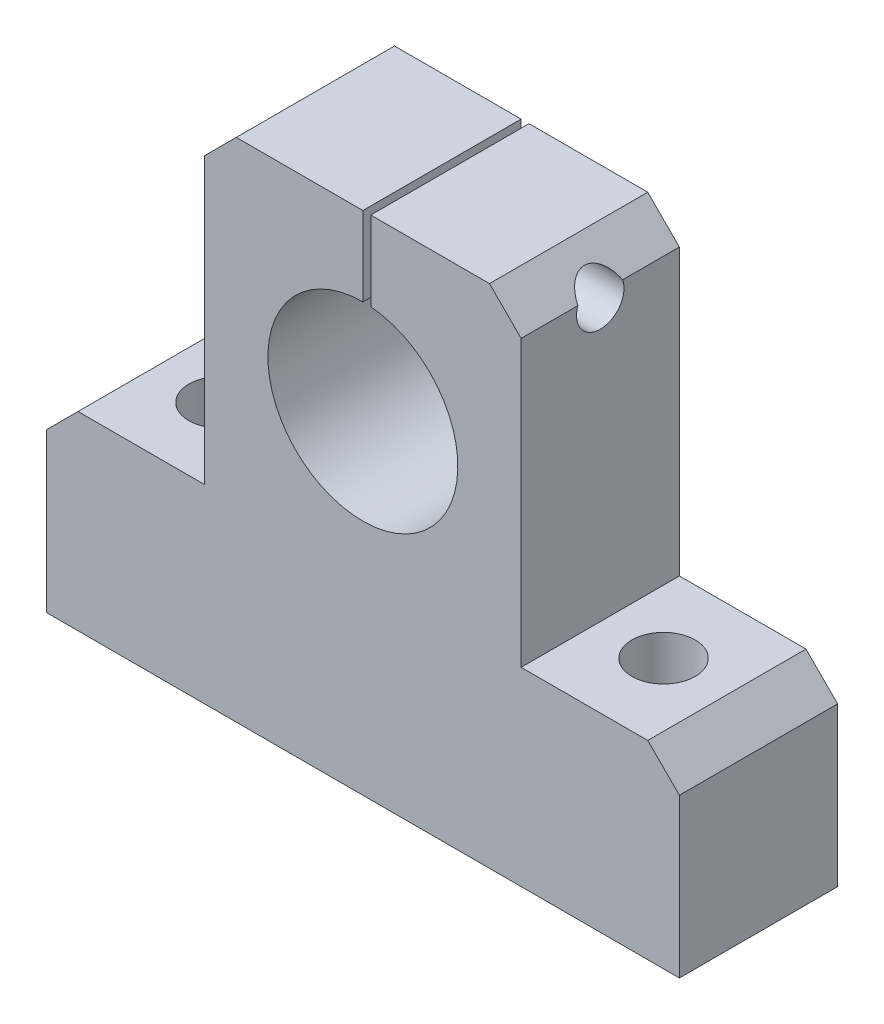
ISO-10303-21;
HEADER;
FILE_DESCRIPTION(('STEP AP214'),'2;1');
FILE_NAME('part.step','',(''),(''),'','','');
FILE_SCHEMA(('AUTOMOTIVE_DESIGN { 1 0 10303 214 1 1 1 1 }'));
ENDSEC;
DATA;
#1=APPLICATION_CONTEXT('core data for automotive mechanical design processes');
#2=APPLICATION_PROTOCOL_DEFINITION('international standard','automotive_design',2000,#1);
#3=PRODUCT_CONTEXT('',#1,'mechanical');
#4=PRODUCT('Part','Part','',(#3));
#5=PRODUCT_RELATED_PRODUCT_CATEGORY('part','',(#4));
#6=PRODUCT_DEFINITION_FORMATION('','',#4);
#7=PRODUCT_DEFINITION_CONTEXT('part definition',#1,'design');
#8=PRODUCT_DEFINITION('design','',#6,#7);
#9=PRODUCT_DEFINITION_SHAPE('','',#8);
#10=(LENGTH_UNIT() NAMED_UNIT(*) SI_UNIT(.MILLI.,.METRE.));
#11=(NAMED_UNIT(*) PLANE_ANGLE_UNIT() SI_UNIT($,.RADIAN.));
#12=(NAMED_UNIT(*) SI_UNIT($,.STERADIAN.) SOLID_ANGLE_UNIT());
#13=UNCERTAINTY_MEASURE_WITH_UNIT(LENGTH_MEASURE(1.E-05),#10,'distance_accuracy_value','');
#14=(GEOMETRIC_REPRESENTATION_CONTEXT(3) GLOBAL_UNCERTAINTY_ASSIGNED_CONTEXT((#13)) GLOBAL_UNIT_ASSIGNED_CONTEXT((#10,
#11,#12)) REPRESENTATION_CONTEXT('',''));
#15=CARTESIAN_POINT('',(0.,0.,0.));
#16=DIRECTION('',(0.,0.,1.));
#17=DIRECTION('',(1.,0.,0.));
#18=AXIS2_PLACEMENT_3D('',#15,#16,#17);
#19=CARTESIAN_POINT('',(-20.,0.,10.));
#20=DIRECTION('',(1.,0.,0.));
#21=DIRECTION('',(0.,0.,-1.));
#22=AXIS2_PLACEMENT_3D('',#19,#20,#21);
#23=PLANE('',#22);
#24=DIRECTION('',(0.,-1.,0.));
#25=VECTOR('',#24,1.);
#26=CARTESIAN_POINT('',(-20.,0.,0.));
#27=LINE('',#26,#25);
#28=CARTESIAN_POINT('',(-20.,10.,0.));
#29=VERTEX_POINT('',#28);
#30=CARTESIAN_POINT('',(-20.,0.,0.));
#31=VERTEX_POINT('',#30);
#32=EDGE_CURVE('E238',#29,#31,#27,.T.);
#33=ORIENTED_EDGE('',*,*,#32,.T.);
#34=DIRECTION('',(0.,0.,-1.));
#35=VECTOR('',#34,1.);
#36=CARTESIAN_POINT('',(-20.,0.,10.));
#37=LINE('',#36,#35);
#38=CARTESIAN_POINT('',(-20.,0.,10.));
#39=VERTEX_POINT('',#38);
#40=EDGE_CURVE('E44',#39,#31,#37,.T.);
#41=ORIENTED_EDGE('',*,*,#40,.F.);
#42=DIRECTION('',(0.,-1.,0.));
#43=VECTOR('',#42,1.);
#44=CARTESIAN_POINT('',(-20.,0.,10.));
#45=LINE('',#44,#43);
#46=CARTESIAN_POINT('',(-20.,10.,10.));
#47=VERTEX_POINT('',#46);
#48=EDGE_CURVE('E239',#47,#39,#45,.T.);
#49=ORIENTED_EDGE('',*,*,#48,.F.);
#50=DIRECTION('',(0.,0.,-1.));
#51=VECTOR('',#50,1.);
#52=CARTESIAN_POINT('',(-20.,10.,10.));
#53=LINE('',#52,#51);
#54=EDGE_CURVE('E272',#47,#29,#53,.T.);
#55=ORIENTED_EDGE('',*,*,#54,.T.);
#56=EDGE_LOOP('',(#33,#41,#49,#55));
#57=FACE_BOUND('',#56,.T.);
#58=ADVANCED_FACE('F36',(#57),#23,.F.);
#59=CARTESIAN_POINT('',(20.,0.,10.));
#60=DIRECTION('',(0.,1.,0.));
#61=DIRECTION('',(-1.,0.,0.));
#62=AXIS2_PLACEMENT_3D('',#59,#60,#61);
#63=PLANE('',#62);
#64=CARTESIAN_POINT('',(14.,0.,5.));
#65=DIRECTION('',(0.,1.,0.));
#66=DIRECTION('',(-1.,0.,0.));
#67=AXIS2_PLACEMENT_3D('',#64,#65,#66);
#68=CIRCLE('',#67,2.);
#69=CARTESIAN_POINT('',(12.,0.,5.));
#70=VERTEX_POINT('',#69);
#71=EDGE_CURVE('E218',#70,#70,#68,.F.);
#72=ORIENTED_EDGE('',*,*,#71,.F.);
#73=EDGE_LOOP('',(#72));
#74=FACE_BOUND('',#73,.T.);
#75=CARTESIAN_POINT('',(-14.,0.,5.));
#76=DIRECTION('',(0.,1.,0.));
#77=DIRECTION('',(-1.,0.,0.));
#78=AXIS2_PLACEMENT_3D('',#75,#76,#77);
#79=CIRCLE('',#78,2.);
#80=CARTESIAN_POINT('',(-16.,0.,5.));
#81=VERTEX_POINT('',#80);
#82=EDGE_CURVE('E223',#81,#81,#79,.F.);
#83=ORIENTED_EDGE('',*,*,#82,.F.);
#84=EDGE_LOOP('',(#83));
#85=FACE_BOUND('',#84,.T.);
#86=DIRECTION('',(1.,0.,0.));
#87=VECTOR('',#86,1.);
#88=CARTESIAN_POINT('',(20.,0.,0.));
#89=LINE('',#88,#87);
#90=CARTESIAN_POINT('',(20.,0.,0.));
#91=VERTEX_POINT('',#90);
#92=EDGE_CURVE('E275',#31,#91,#89,.T.);
#93=ORIENTED_EDGE('',*,*,#92,.T.);
#94=DIRECTION('',(0.,0.,-1.));
#95=VECTOR('',#94,1.);
#96=CARTESIAN_POINT('',(20.,0.,10.));
#97=LINE('',#96,#95);
#98=CARTESIAN_POINT('',(20.,0.,10.));
#99=VERTEX_POINT('',#98);
#100=EDGE_CURVE('E212',#99,#91,#97,.T.);
#101=ORIENTED_EDGE('',*,*,#100,.F.);
#102=DIRECTION('',(1.,0.,0.));
#103=VECTOR('',#102,1.);
#104=CARTESIAN_POINT('',(20.,0.,10.));
#105=LINE('',#104,#103);
#106=EDGE_CURVE('E242',#39,#99,#105,.T.);
#107=ORIENTED_EDGE('',*,*,#106,.F.);
#108=ORIENTED_EDGE('',*,*,#40,.T.);
#109=EDGE_LOOP('',(#93,#101,#107,#108));
#110=FACE_BOUND('',#109,.T.);
#111=ADVANCED_FACE('F382',(#74,#85,#110),#63,.F.);
#112=CARTESIAN_POINT('',(20.,0.,10.));
#113=DIRECTION('',(-1.,0.,0.));
#114=DIRECTION('',(0.,-1.,0.));
#115=AXIS2_PLACEMENT_3D('',#112,#113,#114);
#116=PLANE('',#115);
#117=DIRECTION('',(0.,1.,0.));
#118=VECTOR('',#117,1.);
#119=CARTESIAN_POINT('',(20.,0.,0.));
#120=LINE('',#119,#118);
#121=CARTESIAN_POINT('',(20.,10.,0.));
#122=VERTEX_POINT('',#121);
#123=EDGE_CURVE('E277',#91,#122,#120,.T.);
#124=ORIENTED_EDGE('',*,*,#123,.T.);
#125=DIRECTION('',(0.,0.,-1.));
#126=VECTOR('',#125,1.);
#127=CARTESIAN_POINT('',(20.,10.,10.));
#128=LINE('',#127,#126);
#129=CARTESIAN_POINT('',(20.,10.,10.));
#130=VERTEX_POINT('',#129);
#131=EDGE_CURVE('E209',#130,#122,#128,.T.);
#132=ORIENTED_EDGE('',*,*,#131,.F.);
#133=DIRECTION('',(0.,1.,0.));
#134=VECTOR('',#133,1.);
#135=CARTESIAN_POINT('',(20.,0.,10.));
#136=LINE('',#135,#134);
#137=EDGE_CURVE('E245',#99,#130,#136,.T.);
#138=ORIENTED_EDGE('',*,*,#137,.F.);
#139=ORIENTED_EDGE('',*,*,#100,.T.);
#140=EDGE_LOOP('',(#124,#132,#138,#139));
#141=FACE_BOUND('',#140,.T.);
#142=ADVANCED_FACE('F379',(#141),#116,.F.);
#143=CARTESIAN_POINT('',(20.,10.,10.));
#144=DIRECTION('',(-0.707106781186547,-0.707106781186548,0.));
#145=DIRECTION('',(0.707106781186548,-0.707106781186547,0.));
#146=AXIS2_PLACEMENT_3D('',#143,#144,#145);
#147=PLANE('',#146);
#148=DIRECTION('',(-0.707106781186548,0.707106781186547,0.));
#149=VECTOR('',#148,1.);
#150=CARTESIAN_POINT('',(20.,10.,0.));
#151=LINE('',#150,#149);
#152=CARTESIAN_POINT('',(18.,12.,0.));
#153=VERTEX_POINT('',#152);
#154=EDGE_CURVE('E279',#122,#153,#151,.T.);
#155=ORIENTED_EDGE('',*,*,#154,.T.);
#156=DIRECTION('',(0.,0.,-1.));
#157=VECTOR('',#156,1.);
#158=CARTESIAN_POINT('',(18.,12.,10.));
#159=LINE('',#158,#157);
#160=CARTESIAN_POINT('',(18.,12.,10.));
#161=VERTEX_POINT('',#160);
#162=EDGE_CURVE('E206',#161,#153,#159,.T.);
#163=ORIENTED_EDGE('',*,*,#162,.F.);
#164=DIRECTION('',(-0.707106781186548,0.707106781186547,0.));
#165=VECTOR('',#164,1.);
#166=CARTESIAN_POINT('',(20.,10.,10.));
#167=LINE('',#166,#165);
#168=EDGE_CURVE('E247',#130,#161,#167,.T.);
#169=ORIENTED_EDGE('',*,*,#168,.F.);
#170=ORIENTED_EDGE('',*,*,#131,.T.);
#171=EDGE_LOOP('',(#155,#163,#169,#170));
#172=FACE_BOUND('',#171,.T.);
#173=ADVANCED_FACE('F375',(#172),#147,.F.);
#174=CARTESIAN_POINT('',(18.,12.,10.));
#175=DIRECTION('',(0.,-1.,0.));
#176=DIRECTION('',(1.,0.,0.));
#177=AXIS2_PLACEMENT_3D('',#174,#175,#176);
#178=PLANE('',#177);
#179=CARTESIAN_POINT('',(14.,12.,5.));
#180=DIRECTION('',(0.,-1.,0.));
#181=DIRECTION('',(1.,0.,0.));
#182=AXIS2_PLACEMENT_3D('',#179,#180,#181);
#183=CIRCLE('',#182,2.);
#184=CARTESIAN_POINT('',(16.,12.,5.));
#185=VERTEX_POINT('',#184);
#186=EDGE_CURVE('E39',#185,#185,#183,.F.);
#187=ORIENTED_EDGE('',*,*,#186,.F.);
#188=EDGE_LOOP('',(#187));
#189=FACE_BOUND('',#188,.T.);
#190=DIRECTION('',(-1.,0.,0.));
#191=VECTOR('',#190,1.);
#192=CARTESIAN_POINT('',(18.,12.,0.));
#193=LINE('',#192,#191);
#194=CARTESIAN_POINT('',(10.,12.,0.));
#195=VERTEX_POINT('',#194);
#196=EDGE_CURVE('E281',#153,#195,#193,.T.);
#197=ORIENTED_EDGE('',*,*,#196,.T.);
#198=DIRECTION('',(0.,0.,-1.));
#199=VECTOR('',#198,1.);
#200=CARTESIAN_POINT('',(10.,12.,10.));
#201=LINE('',#200,#199);
#202=CARTESIAN_POINT('',(10.,12.,10.));
#203=VERTEX_POINT('',#202);
#204=EDGE_CURVE('E203',#203,#195,#201,.T.);
#205=ORIENTED_EDGE('',*,*,#204,.F.);
#206=DIRECTION('',(-1.,0.,0.));
#207=VECTOR('',#206,1.);
#208=CARTESIAN_POINT('',(18.,12.,10.));
#209=LINE('',#208,#207);
#210=EDGE_CURVE('E249',#161,#203,#209,.T.);
#211=ORIENTED_EDGE('',*,*,#210,.F.);
#212=ORIENTED_EDGE('',*,*,#162,.T.);
#213=EDGE_LOOP('',(#197,#205,#211,#212));
#214=FACE_BOUND('',#213,.T.);
#215=ADVANCED_FACE('F371',(#189,#214),#178,.F.);
#216=CARTESIAN_POINT('',(10.,12.,10.));
#217=DIRECTION('',(-1.,0.,0.));
#218=DIRECTION('',(0.,-1.,0.));
#219=AXIS2_PLACEMENT_3D('',#216,#217,#218);
#220=PLANE('',#219);
#221=DIRECTION('',(0.,0.,-1.));
#222=VECTOR('',#221,1.);
#223=CARTESIAN_POINT('',(10.,30.,10.));
#224=LINE('',#223,#222);
#225=CARTESIAN_POINT('',(10.,30.,3.5857864376269));
#226=VERTEX_POINT('',#225);
#227=CARTESIAN_POINT('',(10.,30.,0.));
#228=VERTEX_POINT('',#227);
#229=EDGE_CURVE('E199',#226,#228,#224,.T.);
#230=ORIENTED_EDGE('',*,*,#229,.F.);
#231=CARTESIAN_POINT('',(10.,29.5,5.));
#232=DIRECTION('',(-1.,0.,0.));
#233=DIRECTION('',(0.,-1.,0.));
#234=AXIS2_PLACEMENT_3D('',#231,#232,#233);
#235=CIRCLE('',#234,1.5);
#236=CARTESIAN_POINT('',(10.,30.,6.4142135623731));
#237=VERTEX_POINT('',#236);
#238=EDGE_CURVE('E51',#226,#237,#235,.T.);
#239=ORIENTED_EDGE('',*,*,#238,.T.);
#240=CARTESIAN_POINT('',(10.,30.,10.));
#241=VERTEX_POINT('',#240);
#242=EDGE_CURVE('E200',#241,#237,#224,.T.);
#243=ORIENTED_EDGE('',*,*,#242,.F.);
#244=DIRECTION('',(0.,1.,0.));
#245=VECTOR('',#244,1.);
#246=CARTESIAN_POINT('',(10.,12.,10.));
#247=LINE('',#246,#245);
#248=EDGE_CURVE('E251',#203,#241,#247,.T.);
#249=ORIENTED_EDGE('',*,*,#248,.F.);
#250=ORIENTED_EDGE('',*,*,#204,.T.);
#251=DIRECTION('',(0.,1.,0.));
#252=VECTOR('',#251,1.);
#253=CARTESIAN_POINT('',(10.,12.,0.));
#254=LINE('',#253,#252);
#255=EDGE_CURVE('E283',#195,#228,#254,.T.);
#256=ORIENTED_EDGE('',*,*,#255,.T.);
#257=EDGE_LOOP('',(#230,#239,#243,#249,#250,#256));
#258=FACE_BOUND('',#257,.T.);
#259=ADVANCED_FACE('F365',(#258),#220,.F.);
#260=CARTESIAN_POINT('',(10.,30.,10.));
#261=DIRECTION('',(-0.707106781186548,-0.707106781186547,0.));
#262=DIRECTION('',(0.707106781186547,-0.707106781186548,0.));
#263=AXIS2_PLACEMENT_3D('',#260,#261,#262);
#264=PLANE('',#263);
#265=ORIENTED_EDGE('',*,*,#242,.T.);
#266=CARTESIAN_POINT('',(10.5,29.5,5.));
#267=DIRECTION('',(-0.707106781186548,-0.707106781186547,0.));
#268=DIRECTION('',(-0.707106781186547,0.707106781186548,0.));
#269=AXIS2_PLACEMENT_3D('',#266,#267,#268);
#270=ELLIPSE('',#269,2.12132034355964,1.5);
#271=EDGE_CURVE('E235',#237,#226,#270,.T.);
#272=ORIENTED_EDGE('',*,*,#271,.T.);
#273=ORIENTED_EDGE('',*,*,#229,.T.);
#274=DIRECTION('',(-0.707106781186547,0.707106781186548,0.));
#275=VECTOR('',#274,1.);
#276=CARTESIAN_POINT('',(10.,30.,0.));
#277=LINE('',#276,#275);
#278=CARTESIAN_POINT('',(8.,32.,0.));
#279=VERTEX_POINT('',#278);
#280=EDGE_CURVE('E286',#228,#279,#277,.T.);
#281=ORIENTED_EDGE('',*,*,#280,.T.);
#282=DIRECTION('',(0.,0.,-1.));
#283=VECTOR('',#282,1.);
#284=CARTESIAN_POINT('',(8.,32.,10.));
#285=LINE('',#284,#283);
#286=CARTESIAN_POINT('',(8.,32.,10.));
#287=VERTEX_POINT('',#286);
#288=EDGE_CURVE('E196',#287,#279,#285,.T.);
#289=ORIENTED_EDGE('',*,*,#288,.F.);
#290=DIRECTION('',(-0.707106781186547,0.707106781186548,0.));
#291=VECTOR('',#290,1.);
#292=CARTESIAN_POINT('',(10.,30.,10.));
#293=LINE('',#292,#291);
#294=EDGE_CURVE('E253',#241,#287,#293,.T.);
#295=ORIENTED_EDGE('',*,*,#294,.F.);
#296=EDGE_LOOP('',(#265,#272,#273,#281,#289,#295));
#297=FACE_BOUND('',#296,.T.);
#298=ADVANCED_FACE('F359',(#297),#264,.F.);
#299=CARTESIAN_POINT('',(0.500000000000002,32.,10.));
#300=DIRECTION('',(0.,-1.,0.));
#301=DIRECTION('',(0.,0.,-1.));
#302=AXIS2_PLACEMENT_3D('',#299,#300,#301);
#303=PLANE('',#302);
#304=DIRECTION('',(-1.,0.,0.));
#305=VECTOR('',#304,1.);
#306=CARTESIAN_POINT('',(0.500000000000002,32.,0.));
#307=LINE('',#306,#305);
#308=CARTESIAN_POINT('',(0.500000000000002,32.,0.));
#309=VERTEX_POINT('',#308);
#310=EDGE_CURVE('E288',#279,#309,#307,.T.);
#311=ORIENTED_EDGE('',*,*,#310,.T.);
#312=DIRECTION('',(0.,0.,-1.));
#313=VECTOR('',#312,1.);
#314=CARTESIAN_POINT('',(0.500000000000002,32.,10.));
#315=LINE('',#314,#313);
#316=CARTESIAN_POINT('',(0.500000000000002,32.,10.));
#317=VERTEX_POINT('',#316);
#318=EDGE_CURVE('E193',#317,#309,#315,.T.);
#319=ORIENTED_EDGE('',*,*,#318,.F.);
#320=DIRECTION('',(-1.,0.,0.));
#321=VECTOR('',#320,1.);
#322=CARTESIAN_POINT('',(0.500000000000002,32.,10.));
#323=LINE('',#322,#321);
#324=EDGE_CURVE('E255',#287,#317,#323,.T.);
#325=ORIENTED_EDGE('',*,*,#324,.F.);
#326=ORIENTED_EDGE('',*,*,#288,.T.);
#327=EDGE_LOOP('',(#311,#319,#325,#326));
#328=FACE_BOUND('',#327,.T.);
#329=ADVANCED_FACE('F355',(#328),#303,.F.);
#330=CARTESIAN_POINT('',(0.500000000000002,32.,10.));
#331=DIRECTION('',(1.,0.,0.));
#332=DIRECTION('',(0.,0.,-1.));
#333=AXIS2_PLACEMENT_3D('',#330,#331,#332);
#334=PLANE('',#333);
#335=CARTESIAN_POINT('',(0.5,29.5,5.));
#336=DIRECTION('',(1.,0.,0.));
#337=DIRECTION('',(0.,0.,-1.));
#338=AXIS2_PLACEMENT_3D('',#335,#336,#337);
#339=CIRCLE('',#338,1.5);
#340=CARTESIAN_POINT('',(0.5,29.5,3.5));
#341=VERTEX_POINT('',#340);
#342=EDGE_CURVE('E232',#341,#341,#339,.T.);
#343=ORIENTED_EDGE('',*,*,#342,.T.);
#344=EDGE_LOOP('',(#343));
#345=FACE_BOUND('',#344,.T.);
#346=DIRECTION('',(0.,-1.,0.));
#347=VECTOR('',#346,1.);
#348=CARTESIAN_POINT('',(0.500000000000002,32.,0.));
#349=LINE('',#348,#347);
#350=CARTESIAN_POINT('',(0.500000000000002,26.9791303715507,0.));
#351=VERTEX_POINT('',#350);
#352=EDGE_CURVE('E290',#309,#351,#349,.T.);
#353=ORIENTED_EDGE('',*,*,#352,.T.);
#354=DIRECTION('',(0.,0.,-1.));
#355=VECTOR('',#354,1.);
#356=CARTESIAN_POINT('',(0.500000000000002,26.9791303715507,10.));
#357=LINE('',#356,#355);
#358=CARTESIAN_POINT('',(0.500000000000002,26.9791303715507,10.));
#359=VERTEX_POINT('',#358);
#360=EDGE_CURVE('E190',#359,#351,#357,.T.);
#361=ORIENTED_EDGE('',*,*,#360,.F.);
#362=DIRECTION('',(0.,-1.,0.));
#363=VECTOR('',#362,1.);
#364=CARTESIAN_POINT('',(0.500000000000002,32.,10.));
#365=LINE('',#364,#363);
#366=EDGE_CURVE('E257',#317,#359,#365,.T.);
#367=ORIENTED_EDGE('',*,*,#366,.F.);
#368=ORIENTED_EDGE('',*,*,#318,.T.);
#369=EDGE_LOOP('',(#353,#361,#367,#368));
#370=FACE_BOUND('',#369,.T.);
#371=ADVANCED_FACE('F350',(#345,#370),#334,.F.);
#372=CARTESIAN_POINT('',(0.,21.,10.));
#373=DIRECTION('',(0.,0.,-1.));
#374=DIRECTION('',(-1.,0.,0.));
#375=AXIS2_PLACEMENT_3D('',#372,#373,#374);
#376=CYLINDRICAL_SURFACE('',#375,6.);
#377=CARTESIAN_POINT('',(0.,21.,0.));
#378=DIRECTION('',(0.,0.,-1.));
#379=DIRECTION('',(1.,0.,0.));
#380=AXIS2_PLACEMENT_3D('',#377,#378,#379);
#381=CIRCLE('',#380,6.);
#382=CARTESIAN_POINT('',(0.,27.,0.));
#383=VERTEX_POINT('',#382);
#384=EDGE_CURVE('E292',#351,#383,#381,.T.);
#385=ORIENTED_EDGE('',*,*,#384,.T.);
#386=DIRECTION('',(0.,0.,-1.));
#387=VECTOR('',#386,1.);
#388=CARTESIAN_POINT('',(0.,27.,10.));
#389=LINE('',#388,#387);
#390=CARTESIAN_POINT('',(0.,27.,10.));
#391=VERTEX_POINT('',#390);
#392=EDGE_CURVE('E187',#391,#383,#389,.T.);
#393=ORIENTED_EDGE('',*,*,#392,.F.);
#394=CARTESIAN_POINT('',(0.,21.,10.));
#395=DIRECTION('',(0.,0.,-1.));
#396=DIRECTION('',(1.,0.,0.));
#397=AXIS2_PLACEMENT_3D('',#394,#395,#396);
#398=CIRCLE('',#397,6.);
#399=EDGE_CURVE('E259',#359,#391,#398,.T.);
#400=ORIENTED_EDGE('',*,*,#399,.F.);
#401=ORIENTED_EDGE('',*,*,#360,.T.);
#402=EDGE_LOOP('',(#385,#393,#400,#401));
#403=FACE_BOUND('',#402,.T.);
#404=ADVANCED_FACE('F344',(#403),#376,.F.);
#405=CARTESIAN_POINT('',(0.,27.,10.));
#406=DIRECTION('',(-1.,0.,0.));
#407=DIRECTION('',(0.,-1.,0.));
#408=AXIS2_PLACEMENT_3D('',#405,#406,#407);
#409=PLANE('',#408);
#410=CARTESIAN_POINT('',(0.,29.5,5.));
#411=DIRECTION('',(-1.,0.,0.));
#412=DIRECTION('',(0.,-1.,0.));
#413=AXIS2_PLACEMENT_3D('',#410,#411,#412);
#414=CIRCLE('',#413,1.5);
#415=CARTESIAN_POINT('',(0.,28.,5.));
#416=VERTEX_POINT('',#415);
#417=EDGE_CURVE('E171',#416,#416,#414,.T.);
#418=ORIENTED_EDGE('',*,*,#417,.T.);
#419=EDGE_LOOP('',(#418));
#420=FACE_BOUND('',#419,.T.);
#421=DIRECTION('',(0.,1.,0.));
#422=VECTOR('',#421,1.);
#423=CARTESIAN_POINT('',(0.,27.,0.));
#424=LINE('',#423,#422);
#425=CARTESIAN_POINT('',(0.,32.,0.));
#426=VERTEX_POINT('',#425);
#427=EDGE_CURVE('E294',#383,#426,#424,.T.);
#428=ORIENTED_EDGE('',*,*,#427,.T.);
#429=DIRECTION('',(0.,0.,-1.));
#430=VECTOR('',#429,1.);
#431=CARTESIAN_POINT('',(0.,32.,10.));
#432=LINE('',#431,#430);
#433=CARTESIAN_POINT('',(0.,32.,10.));
#434=VERTEX_POINT('',#433);
#435=EDGE_CURVE('E179',#434,#426,#432,.T.);
#436=ORIENTED_EDGE('',*,*,#435,.F.);
#437=DIRECTION('',(0.,1.,0.));
#438=VECTOR('',#437,1.);
#439=CARTESIAN_POINT('',(0.,27.,10.));
#440=LINE('',#439,#438);
#441=EDGE_CURVE('E261',#391,#434,#440,.T.);
#442=ORIENTED_EDGE('',*,*,#441,.F.);
#443=ORIENTED_EDGE('',*,*,#392,.T.);
#444=EDGE_LOOP('',(#428,#436,#442,#443));
#445=FACE_BOUND('',#444,.T.);
#446=ADVANCED_FACE('F340',(#420,#445),#409,.F.);
#447=CARTESIAN_POINT('',(-8.,32.,10.));
#448=DIRECTION('',(0.,-1.,0.));
#449=DIRECTION('',(0.,0.,-1.));
#450=AXIS2_PLACEMENT_3D('',#447,#448,#449);
#451=PLANE('',#450);
#452=DIRECTION('',(-1.,0.,0.));
#453=VECTOR('',#452,1.);
#454=CARTESIAN_POINT('',(-8.,32.,0.));
#455=LINE('',#454,#453);
#456=CARTESIAN_POINT('',(-8.,32.,0.));
#457=VERTEX_POINT('',#456);
#458=EDGE_CURVE('E296',#426,#457,#455,.T.);
#459=ORIENTED_EDGE('',*,*,#458,.T.);
#460=DIRECTION('',(0.,0.,-1.));
#461=VECTOR('',#460,1.);
#462=CARTESIAN_POINT('',(-8.,32.,10.));
#463=LINE('',#462,#461);
#464=CARTESIAN_POINT('',(-8.,32.,10.));
#465=VERTEX_POINT('',#464);
#466=EDGE_CURVE('E176',#465,#457,#463,.T.);
#467=ORIENTED_EDGE('',*,*,#466,.F.);
#468=DIRECTION('',(-1.,0.,0.));
#469=VECTOR('',#468,1.);
#470=CARTESIAN_POINT('',(-8.,32.,10.));
#471=LINE('',#470,#469);
#472=EDGE_CURVE('E263',#434,#465,#471,.T.);
#473=ORIENTED_EDGE('',*,*,#472,.F.);
#474=ORIENTED_EDGE('',*,*,#435,.T.);
#475=EDGE_LOOP('',(#459,#467,#473,#474));
#476=FACE_BOUND('',#475,.T.);
#477=ADVANCED_FACE('F336',(#476),#451,.F.);
#478=CARTESIAN_POINT('',(-10.,30.,10.));
#479=DIRECTION('',(0.707106781186548,-0.707106781186547,0.));
#480=DIRECTION('',(0.707106781186547,0.707106781186548,0.));
#481=AXIS2_PLACEMENT_3D('',#478,#479,#480);
#482=PLANE('',#481);
#483=DIRECTION('',(0.,0.,-1.));
#484=VECTOR('',#483,1.);
#485=CARTESIAN_POINT('',(-10.,30.,10.));
#486=LINE('',#485,#484);
#487=CARTESIAN_POINT('',(-9.99999999999999,30.,3.5857864376269));
#488=VERTEX_POINT('',#487);
#489=CARTESIAN_POINT('',(-10.,30.,0.));
#490=VERTEX_POINT('',#489);
#491=EDGE_CURVE('E170',#488,#490,#486,.T.);
#492=ORIENTED_EDGE('',*,*,#491,.F.);
#493=CARTESIAN_POINT('',(-10.5,29.5,5.));
#494=DIRECTION('',(0.707106781186548,-0.707106781186547,0.));
#495=DIRECTION('',(-0.707106781186547,-0.707106781186548,0.));
#496=AXIS2_PLACEMENT_3D('',#493,#494,#495);
#497=ELLIPSE('',#496,2.12132034355964,1.5);
#498=CARTESIAN_POINT('',(-9.99999999999999,30.,6.4142135623731));
#499=VERTEX_POINT('',#498);
#500=EDGE_CURVE('E58',#488,#499,#497,.T.);
#501=ORIENTED_EDGE('',*,*,#500,.T.);
#502=CARTESIAN_POINT('',(-10.,30.,10.));
#503=VERTEX_POINT('',#502);
#504=EDGE_CURVE('E167',#503,#499,#486,.T.);
#505=ORIENTED_EDGE('',*,*,#504,.F.);
#506=DIRECTION('',(-0.707106781186547,-0.707106781186548,0.));
#507=VECTOR('',#506,1.);
#508=CARTESIAN_POINT('',(-10.,30.,10.));
#509=LINE('',#508,#507);
#510=EDGE_CURVE('E265',#465,#503,#509,.T.);
#511=ORIENTED_EDGE('',*,*,#510,.F.);
#512=ORIENTED_EDGE('',*,*,#466,.T.);
#513=DIRECTION('',(-0.707106781186547,-0.707106781186548,0.));
#514=VECTOR('',#513,1.);
#515=CARTESIAN_POINT('',(-10.,30.,0.));
#516=LINE('',#515,#514);
#517=EDGE_CURVE('E298',#457,#490,#516,.T.);
#518=ORIENTED_EDGE('',*,*,#517,.T.);
#519=EDGE_LOOP('',(#492,#501,#505,#511,#512,#518));
#520=FACE_BOUND('',#519,.T.);
#521=ADVANCED_FACE('F165',(#520),#482,.F.);
#522=CARTESIAN_POINT('',(-10.,12.,10.));
#523=DIRECTION('',(1.,0.,0.));
#524=DIRECTION('',(0.,0.,-1.));
#525=AXIS2_PLACEMENT_3D('',#522,#523,#524);
#526=PLANE('',#525);
#527=ORIENTED_EDGE('',*,*,#504,.T.);
#528=CARTESIAN_POINT('',(-9.99999999999999,29.5,5.));
#529=DIRECTION('',(1.,0.,0.));
#530=DIRECTION('',(0.,0.,-1.));
#531=AXIS2_PLACEMENT_3D('',#528,#529,#530);
#532=CIRCLE('',#531,1.5);
#533=EDGE_CURVE('E11',#499,#488,#532,.T.);
#534=ORIENTED_EDGE('',*,*,#533,.T.);
#535=ORIENTED_EDGE('',*,*,#491,.T.);
#536=DIRECTION('',(0.,-1.,0.));
#537=VECTOR('',#536,1.);
#538=CARTESIAN_POINT('',(-10.,12.,0.));
#539=LINE('',#538,#537);
#540=CARTESIAN_POINT('',(-10.,12.,0.));
#541=VERTEX_POINT('',#540);
#542=EDGE_CURVE('E300',#490,#541,#539,.T.);
#543=ORIENTED_EDGE('',*,*,#542,.T.);
#544=DIRECTION('',(0.,0.,-1.));
#545=VECTOR('',#544,1.);
#546=CARTESIAN_POINT('',(-10.,12.,10.));
#547=LINE('',#546,#545);
#548=CARTESIAN_POINT('',(-10.,12.,10.));
#549=VERTEX_POINT('',#548);
#550=EDGE_CURVE('E181',#549,#541,#547,.T.);
#551=ORIENTED_EDGE('',*,*,#550,.F.);
#552=DIRECTION('',(0.,-1.,0.));
#553=VECTOR('',#552,1.);
#554=CARTESIAN_POINT('',(-10.,12.,10.));
#555=LINE('',#554,#553);
#556=EDGE_CURVE('E175',#503,#549,#555,.T.);
#557=ORIENTED_EDGE('',*,*,#556,.F.);
#558=EDGE_LOOP('',(#527,#534,#535,#543,#551,#557));
#559=FACE_BOUND('',#558,.T.);
#560=ADVANCED_FACE('F173',(#559),#526,.F.);
#561=CARTESIAN_POINT('',(-18.,12.,10.));
#562=DIRECTION('',(0.,-1.,0.));
#563=DIRECTION('',(1.,0.,0.));
#564=AXIS2_PLACEMENT_3D('',#561,#562,#563);
#565=PLANE('',#564);
#566=CARTESIAN_POINT('',(-14.,12.,5.));
#567=DIRECTION('',(0.,-1.,0.));
#568=DIRECTION('',(1.,0.,0.));
#569=AXIS2_PLACEMENT_3D('',#566,#567,#568);
#570=CIRCLE('',#569,2.);
#571=CARTESIAN_POINT('',(-12.,12.,5.));
#572=VERTEX_POINT('',#571);
#573=EDGE_CURVE('E216',#572,#572,#570,.F.);
#574=ORIENTED_EDGE('',*,*,#573,.F.);
#575=EDGE_LOOP('',(#574));
#576=FACE_BOUND('',#575,.T.);
#577=DIRECTION('',(-1.,0.,0.));
#578=VECTOR('',#577,1.);
#579=CARTESIAN_POINT('',(-18.,12.,0.));
#580=LINE('',#579,#578);
#581=CARTESIAN_POINT('',(-18.,12.,0.));
#582=VERTEX_POINT('',#581);
#583=EDGE_CURVE('E302',#541,#582,#580,.T.);
#584=ORIENTED_EDGE('',*,*,#583,.T.);
#585=DIRECTION('',(0.,0.,-1.));
#586=VECTOR('',#585,1.);
#587=CARTESIAN_POINT('',(-18.,12.,10.));
#588=LINE('',#587,#586);
#589=CARTESIAN_POINT('',(-18.,12.,10.));
#590=VERTEX_POINT('',#589);
#591=EDGE_CURVE('E306',#590,#582,#588,.T.);
#592=ORIENTED_EDGE('',*,*,#591,.F.);
#593=DIRECTION('',(-1.,0.,0.));
#594=VECTOR('',#593,1.);
#595=CARTESIAN_POINT('',(-18.,12.,10.));
#596=LINE('',#595,#594);
#597=EDGE_CURVE('E268',#549,#590,#596,.T.);
#598=ORIENTED_EDGE('',*,*,#597,.F.);
#599=ORIENTED_EDGE('',*,*,#550,.T.);
#600=EDGE_LOOP('',(#584,#592,#598,#599));
#601=FACE_BOUND('',#600,.T.);
#602=ADVANCED_FACE('F316',(#576,#601),#565,.F.);
#603=CARTESIAN_POINT('',(-20.,10.,10.));
#604=DIRECTION('',(0.707106781186548,-0.707106781186547,0.));
#605=DIRECTION('',(0.707106781186547,0.707106781186548,0.));
#606=AXIS2_PLACEMENT_3D('',#603,#604,#605);
#607=PLANE('',#606);
#608=DIRECTION('',(-0.707106781186547,-0.707106781186548,0.));
#609=VECTOR('',#608,1.);
#610=CARTESIAN_POINT('',(-20.,10.,0.));
#611=LINE('',#610,#609);
#612=EDGE_CURVE('E243',#582,#29,#611,.T.);
#613=ORIENTED_EDGE('',*,*,#612,.T.);
#614=ORIENTED_EDGE('',*,*,#54,.F.);
#615=DIRECTION('',(-0.707106781186547,-0.707106781186548,0.));
#616=VECTOR('',#615,1.);
#617=CARTESIAN_POINT('',(-20.,10.,10.));
#618=LINE('',#617,#616);
#619=EDGE_CURVE('E270',#590,#47,#618,.T.);
#620=ORIENTED_EDGE('',*,*,#619,.F.);
#621=ORIENTED_EDGE('',*,*,#591,.T.);
#622=EDGE_LOOP('',(#613,#614,#620,#621));
#623=FACE_BOUND('',#622,.T.);
#624=ADVANCED_FACE('F323',(#623),#607,.F.);
#625=CARTESIAN_POINT('',(0.,21.,10.));
#626=DIRECTION('',(0.,0.,1.));
#627=DIRECTION('',(1.,0.,0.));
#628=AXIS2_PLACEMENT_3D('',#625,#626,#627);
#629=PLANE('',#628);
#630=ORIENTED_EDGE('',*,*,#48,.T.);
#631=ORIENTED_EDGE('',*,*,#106,.T.);
#632=ORIENTED_EDGE('',*,*,#137,.T.);
#633=ORIENTED_EDGE('',*,*,#168,.T.);
#634=ORIENTED_EDGE('',*,*,#210,.T.);
#635=ORIENTED_EDGE('',*,*,#248,.T.);
#636=ORIENTED_EDGE('',*,*,#294,.T.);
#637=ORIENTED_EDGE('',*,*,#324,.T.);
#638=ORIENTED_EDGE('',*,*,#366,.T.);
#639=ORIENTED_EDGE('',*,*,#399,.T.);
#640=ORIENTED_EDGE('',*,*,#441,.T.);
#641=ORIENTED_EDGE('',*,*,#472,.T.);
#642=ORIENTED_EDGE('',*,*,#510,.T.);
#643=ORIENTED_EDGE('',*,*,#556,.T.);
#644=ORIENTED_EDGE('',*,*,#597,.T.);
#645=ORIENTED_EDGE('',*,*,#619,.T.);
#646=EDGE_LOOP('',(#630,#631,#632,#633,#634,#635,#636,#637,#638,#639,#640,#641,#642,#643,#644,#645));
#647=FACE_BOUND('',#646,.T.);
#648=ADVANCED_FACE('F328',(#647),#629,.T.);
#649=CARTESIAN_POINT('',(0.,21.,0.));
#650=DIRECTION('',(0.,0.,1.));
#651=DIRECTION('',(1.,0.,0.));
#652=AXIS2_PLACEMENT_3D('',#649,#650,#651);
#653=PLANE('',#652);
#654=ORIENTED_EDGE('',*,*,#32,.F.);
#655=ORIENTED_EDGE('',*,*,#612,.F.);
#656=ORIENTED_EDGE('',*,*,#583,.F.);
#657=ORIENTED_EDGE('',*,*,#542,.F.);
#658=ORIENTED_EDGE('',*,*,#517,.F.);
#659=ORIENTED_EDGE('',*,*,#458,.F.);
#660=ORIENTED_EDGE('',*,*,#427,.F.);
#661=ORIENTED_EDGE('',*,*,#384,.F.);
#662=ORIENTED_EDGE('',*,*,#352,.F.);
#663=ORIENTED_EDGE('',*,*,#310,.F.);
#664=ORIENTED_EDGE('',*,*,#280,.F.);
#665=ORIENTED_EDGE('',*,*,#255,.F.);
#666=ORIENTED_EDGE('',*,*,#196,.F.);
#667=ORIENTED_EDGE('',*,*,#154,.F.);
#668=ORIENTED_EDGE('',*,*,#123,.F.);
#669=ORIENTED_EDGE('',*,*,#92,.F.);
#670=EDGE_LOOP('',(#654,#655,#656,#657,#658,#659,#660,#661,#662,#663,#664,#665,#666,#667,#668,#669));
#671=FACE_BOUND('',#670,.T.);
#672=ADVANCED_FACE('F320',(#671),#653,.F.);
#673=CARTESIAN_POINT('',(20.,29.5,5.));
#674=DIRECTION('',(-1.,0.,0.));
#675=DIRECTION('',(0.,-1.,0.));
#676=AXIS2_PLACEMENT_3D('',#673,#674,#675);
#677=CYLINDRICAL_SURFACE('',#676,1.5);
#678=ORIENTED_EDGE('',*,*,#533,.F.);
#679=ORIENTED_EDGE('',*,*,#500,.F.);
#680=EDGE_LOOP('',(#678,#679));
#681=FACE_BOUND('',#680,.T.);
#682=ORIENTED_EDGE('',*,*,#417,.F.);
#683=EDGE_LOOP('',(#682));
#684=FACE_BOUND('',#683,.T.);
#685=ADVANCED_FACE('F158',(#681,#684),#677,.F.);
#686=ORIENTED_EDGE('',*,*,#342,.F.);
#687=EDGE_LOOP('',(#686));
#688=FACE_BOUND('',#687,.T.);
#689=ORIENTED_EDGE('',*,*,#271,.F.);
#690=ORIENTED_EDGE('',*,*,#238,.F.);
#691=EDGE_LOOP('',(#689,#690));
#692=FACE_BOUND('',#691,.T.);
#693=ADVANCED_FACE('F426',(#688,#692),#677,.F.);
#694=CARTESIAN_POINT('',(-14.,32.,5.));
#695=DIRECTION('',(0.,-1.,0.));
#696=DIRECTION('',(0.,0.,-1.));
#697=AXIS2_PLACEMENT_3D('',#694,#695,#696);
#698=CYLINDRICAL_SURFACE('',#697,2.);
#699=ORIENTED_EDGE('',*,*,#82,.T.);
#700=EDGE_LOOP('',(#699));
#701=FACE_BOUND('',#700,.T.);
#702=ORIENTED_EDGE('',*,*,#573,.T.);
#703=EDGE_LOOP('',(#702));
#704=FACE_BOUND('',#703,.T.);
#705=ADVANCED_FACE('F429',(#701,#704),#698,.F.);
#706=CARTESIAN_POINT('',(14.,32.,5.));
#707=DIRECTION('',(0.,-1.,0.));
#708=DIRECTION('',(0.,0.,-1.));
#709=AXIS2_PLACEMENT_3D('',#706,#707,#708);
#710=CYLINDRICAL_SURFACE('',#709,2.);
#711=ORIENTED_EDGE('',*,*,#71,.T.);
#712=EDGE_LOOP('',(#711));
#713=FACE_BOUND('',#712,.T.);
#714=ORIENTED_EDGE('',*,*,#186,.T.);
#715=EDGE_LOOP('',(#714));
#716=FACE_BOUND('',#715,.T.);
#717=ADVANCED_FACE('F433',(#713,#716),#710,.F.);
#718=CLOSED_SHELL('',(#58,#111,#142,#173,#215,#259,#298,#329,#371,#404,#446,#477,#521,#560,#602,
#624,#648,#672,#685,#693,#705,#717));
#719=MANIFOLD_SOLID_BREP('B2',#718);
#720=ADVANCED_BREP_SHAPE_REPRESENTATION('',(#18,#719),#14);
#721=SHAPE_DEFINITION_REPRESENTATION(#9,#720);
ENDSEC;
END-ISO-10303-21;
